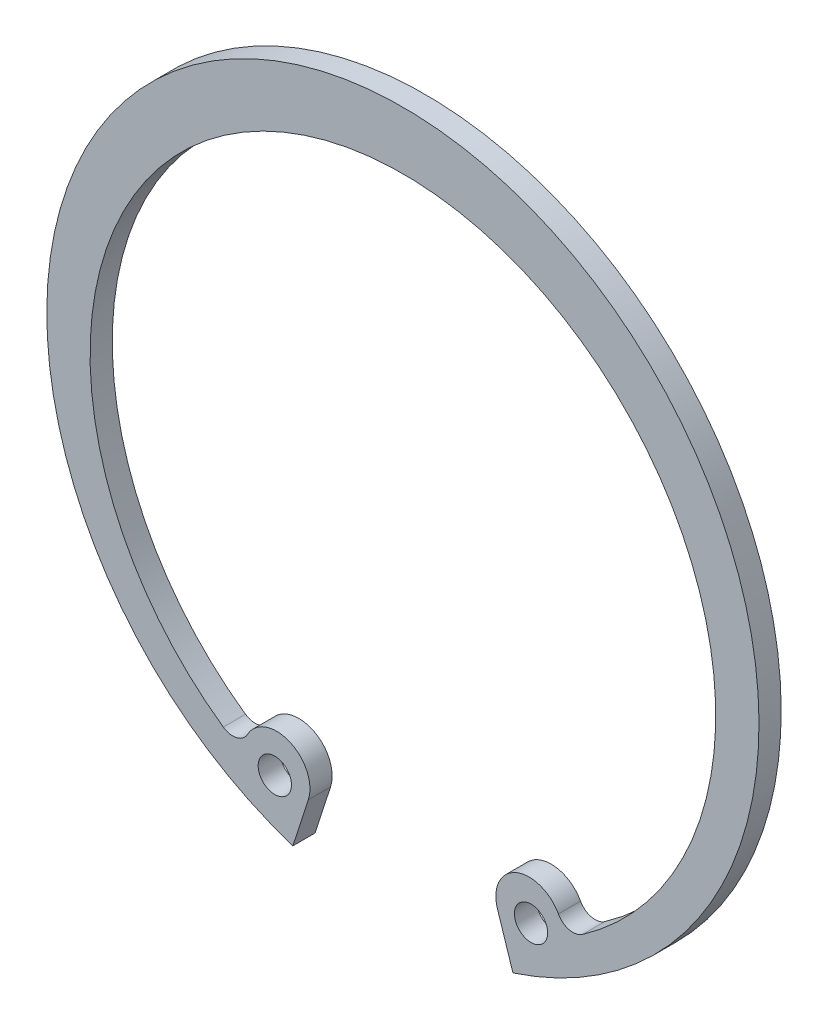
ISO-10303-21;
HEADER;
FILE_DESCRIPTION(('STEP AP214'),'2;1');
FILE_NAME('part.step','',(''),(''),'','','');
FILE_SCHEMA(('AUTOMOTIVE_DESIGN { 1 0 10303 214 1 1 1 1 }'));
ENDSEC;
DATA;
#1=APPLICATION_CONTEXT('core data for automotive mechanical design processes');
#2=APPLICATION_PROTOCOL_DEFINITION('international standard','automotive_design',2000,#1);
#3=PRODUCT_CONTEXT('',#1,'mechanical');
#4=PRODUCT('Part','Part','',(#3));
#5=PRODUCT_RELATED_PRODUCT_CATEGORY('part','',(#4));
#6=PRODUCT_DEFINITION_FORMATION('','',#4);
#7=PRODUCT_DEFINITION_CONTEXT('part definition',#1,'design');
#8=PRODUCT_DEFINITION('design','',#6,#7);
#9=PRODUCT_DEFINITION_SHAPE('','',#8);
#10=(LENGTH_UNIT() NAMED_UNIT(*) SI_UNIT(.MILLI.,.METRE.));
#11=(NAMED_UNIT(*) PLANE_ANGLE_UNIT() SI_UNIT($,.RADIAN.));
#12=(NAMED_UNIT(*) SI_UNIT($,.STERADIAN.) SOLID_ANGLE_UNIT());
#13=UNCERTAINTY_MEASURE_WITH_UNIT(LENGTH_MEASURE(1.E-05),#10,'distance_accuracy_value','');
#14=(GEOMETRIC_REPRESENTATION_CONTEXT(3) GLOBAL_UNCERTAINTY_ASSIGNED_CONTEXT((#13)) GLOBAL_UNIT_ASSIGNED_CONTEXT((#10,
#11,#12)) REPRESENTATION_CONTEXT('',''));
#15=CARTESIAN_POINT('',(0.,0.,0.));
#16=DIRECTION('',(0.,0.,1.));
#17=DIRECTION('',(1.,0.,0.));
#18=AXIS2_PLACEMENT_3D('',#15,#16,#17);
#19=CARTESIAN_POINT('',(-11.378133000963,-25.310088688355,2.));
#20=DIRECTION('',(0.,0.,1.));
#21=DIRECTION('',(1.,0.,0.));
#22=AXIS2_PLACEMENT_3D('',#19,#20,#21);
#23=PLANE('',#22);
#24=CARTESIAN_POINT('',(-11.5490746864897,-25.8361930997174,2.));
#25=DIRECTION('',(0.,0.,1.));
#26=DIRECTION('',(1.,0.,0.));
#27=AXIS2_PLACEMENT_3D('',#24,#25,#26);
#28=CIRCLE('',#27,1.5);
#29=CARTESIAN_POINT('',(-10.0490746864897,-25.8361930997174,2.));
#30=VERTEX_POINT('',#29);
#31=EDGE_CURVE('E139',#30,#30,#28,.T.);
#32=ORIENTED_EDGE('',*,*,#31,.F.);
#33=EDGE_LOOP('',(#32));
#34=FACE_BOUND('',#33,.T.);
#35=CARTESIAN_POINT('',(-11.378133000963,-25.310088688355,2.));
#36=DIRECTION('',(0.,0.,1.));
#37=DIRECTION('',(1.,0.,0.));
#38=AXIS2_PLACEMENT_3D('',#35,#36,#37);
#39=CIRCLE('',#38,3.);
#40=CARTESIAN_POINT('',(-8.52496345207758,-26.2371396714798,2.));
#41=VERTEX_POINT('',#40);
#42=CARTESIAN_POINT('',(-14.0134423692481,-23.8765111587358,2.));
#43=VERTEX_POINT('',#42);
#44=EDGE_CURVE('E152',#41,#43,#39,.T.);
#45=ORIENTED_EDGE('',*,*,#44,.T.);
#46=CARTESIAN_POINT('',(-15.3310970533906,-23.1597223939262,2.));
#47=DIRECTION('',(0.,0.,-1.));
#48=DIRECTION('',(-1.,0.,0.));
#49=AXIS2_PLACEMENT_3D('',#46,#47,#48);
#50=CIRCLE('',#49,1.5);
#51=CARTESIAN_POINT('',(-16.1923946406597,-24.3877966857198,2.));
#52=VERTEX_POINT('',#51);
#53=EDGE_CURVE('E98',#43,#52,#50,.T.);
#54=ORIENTED_EDGE('',*,*,#53,.T.);
#55=CARTESIAN_POINT('',(0.,-1.3,2.));
#56=DIRECTION('',(0.,0.,-1.));
#57=DIRECTION('',(1.,0.,0.));
#58=AXIS2_PLACEMENT_3D('',#55,#56,#57);
#59=CIRCLE('',#58,28.2);
#60=CARTESIAN_POINT('',(16.1923946406598,-24.3877966857198,2.));
#61=VERTEX_POINT('',#60);
#62=EDGE_CURVE('E167',#52,#61,#59,.T.);
#63=ORIENTED_EDGE('',*,*,#62,.T.);
#64=CARTESIAN_POINT('',(15.3310970533906,-23.1597223939262,2.));
#65=DIRECTION('',(0.,0.,-1.));
#66=DIRECTION('',(1.,0.,0.));
#67=AXIS2_PLACEMENT_3D('',#64,#65,#66);
#68=CIRCLE('',#67,1.5);
#69=CARTESIAN_POINT('',(14.0134423692481,-23.8765111587358,2.));
#70=VERTEX_POINT('',#69);
#71=EDGE_CURVE('E180',#61,#70,#68,.T.);
#72=ORIENTED_EDGE('',*,*,#71,.T.);
#73=CARTESIAN_POINT('',(11.3781330009631,-25.310088688355,2.));
#74=DIRECTION('',(0.,0.,1.));
#75=DIRECTION('',(-1.,0.,0.));
#76=AXIS2_PLACEMENT_3D('',#73,#74,#75);
#77=CIRCLE('',#76,3.);
#78=CARTESIAN_POINT('',(8.5249634520776,-26.2371396714798,2.));
#79=VERTEX_POINT('',#78);
#80=EDGE_CURVE('E117',#70,#79,#77,.T.);
#81=ORIENTED_EDGE('',*,*,#80,.T.);
#82=DIRECTION('',(0.309016994374948,-0.951056516295153,0.));
#83=VECTOR('',#82,1.);
#84=CARTESIAN_POINT('',(8.5249634520776,-26.2371396714798,2.));
#85=LINE('',#84,#83);
#86=CARTESIAN_POINT('',(9.91944551943583,-30.5289141730744,2.));
#87=VERTEX_POINT('',#86);
#88=EDGE_CURVE('E111',#79,#87,#85,.T.);
#89=ORIENTED_EDGE('',*,*,#88,.T.);
#90=CARTESIAN_POINT('',(0.,0.,2.));
#91=DIRECTION('',(0.,0.,1.));
#92=DIRECTION('',(1.,0.,0.));
#93=AXIS2_PLACEMENT_3D('',#90,#91,#92);
#94=CIRCLE('',#93,32.1);
#95=CARTESIAN_POINT('',(-9.91944551943583,-30.5289141730744,2.));
#96=VERTEX_POINT('',#95);
#97=EDGE_CURVE('E115',#87,#96,#94,.T.);
#98=ORIENTED_EDGE('',*,*,#97,.T.);
#99=DIRECTION('',(0.309016994374948,0.951056516295153,0.));
#100=VECTOR('',#99,1.);
#101=CARTESIAN_POINT('',(-8.52496345207758,-26.2371396714798,2.));
#102=LINE('',#101,#100);
#103=EDGE_CURVE('E55',#96,#41,#102,.T.);
#104=ORIENTED_EDGE('',*,*,#103,.T.);
#105=EDGE_LOOP('',(#45,#54,#63,#72,#81,#89,#98,#104));
#106=FACE_BOUND('',#105,.T.);
#107=CARTESIAN_POINT('',(11.5490746864897,-25.8361930997174,2.));
#108=DIRECTION('',(0.,0.,1.));
#109=DIRECTION('',(-1.,0.,0.));
#110=AXIS2_PLACEMENT_3D('',#107,#108,#109);
#111=CIRCLE('',#110,1.5);
#112=CARTESIAN_POINT('',(10.0490746864897,-25.8361930997174,2.));
#113=VERTEX_POINT('',#112);
#114=EDGE_CURVE('E190',#113,#113,#111,.T.);
#115=ORIENTED_EDGE('',*,*,#114,.F.);
#116=EDGE_LOOP('',(#115));
#117=FACE_BOUND('',#116,.T.);
#118=ADVANCED_FACE('F38',(#34,#106,#117),#23,.T.);
#119=CARTESIAN_POINT('',(-11.378133000963,-25.310088688355,0.));
#120=DIRECTION('',(0.,0.,1.));
#121=DIRECTION('',(1.,0.,0.));
#122=AXIS2_PLACEMENT_3D('',#119,#120,#121);
#123=PLANE('',#122);
#124=CARTESIAN_POINT('',(-11.378133000963,-25.310088688355,0.));
#125=DIRECTION('',(0.,0.,1.));
#126=DIRECTION('',(1.,0.,0.));
#127=AXIS2_PLACEMENT_3D('',#124,#125,#126);
#128=CIRCLE('',#127,3.);
#129=CARTESIAN_POINT('',(-8.52496345207758,-26.2371396714798,0.));
#130=VERTEX_POINT('',#129);
#131=CARTESIAN_POINT('',(-14.0134423692481,-23.8765111587358,0.));
#132=VERTEX_POINT('',#131);
#133=EDGE_CURVE('E135',#130,#132,#128,.T.);
#134=ORIENTED_EDGE('',*,*,#133,.F.);
#135=DIRECTION('',(0.309016994374948,0.951056516295153,0.));
#136=VECTOR('',#135,1.);
#137=CARTESIAN_POINT('',(-8.52496345207758,-26.2371396714798,0.));
#138=LINE('',#137,#136);
#139=CARTESIAN_POINT('',(-9.91944551943583,-30.5289141730744,0.));
#140=VERTEX_POINT('',#139);
#141=EDGE_CURVE('E90',#140,#130,#138,.T.);
#142=ORIENTED_EDGE('',*,*,#141,.F.);
#143=CARTESIAN_POINT('',(0.,0.,0.));
#144=DIRECTION('',(0.,0.,1.));
#145=DIRECTION('',(1.,0.,0.));
#146=AXIS2_PLACEMENT_3D('',#143,#144,#145);
#147=CIRCLE('',#146,32.1);
#148=CARTESIAN_POINT('',(9.91944551943583,-30.5289141730744,0.));
#149=VERTEX_POINT('',#148);
#150=EDGE_CURVE('E84',#149,#140,#147,.T.);
#151=ORIENTED_EDGE('',*,*,#150,.F.);
#152=DIRECTION('',(0.309016994374948,-0.951056516295153,0.));
#153=VECTOR('',#152,1.);
#154=CARTESIAN_POINT('',(8.5249634520776,-26.2371396714798,0.));
#155=LINE('',#154,#153);
#156=CARTESIAN_POINT('',(8.5249634520776,-26.2371396714798,0.));
#157=VERTEX_POINT('',#156);
#158=EDGE_CURVE('E125',#157,#149,#155,.T.);
#159=ORIENTED_EDGE('',*,*,#158,.F.);
#160=CARTESIAN_POINT('',(11.3781330009631,-25.310088688355,0.));
#161=DIRECTION('',(0.,0.,1.));
#162=DIRECTION('',(-1.,0.,0.));
#163=AXIS2_PLACEMENT_3D('',#160,#161,#162);
#164=CIRCLE('',#163,3.);
#165=CARTESIAN_POINT('',(14.0134423692481,-23.8765111587358,0.));
#166=VERTEX_POINT('',#165);
#167=EDGE_CURVE('E146',#166,#157,#164,.T.);
#168=ORIENTED_EDGE('',*,*,#167,.F.);
#169=CARTESIAN_POINT('',(15.3310970533906,-23.1597223939262,0.));
#170=DIRECTION('',(0.,0.,-1.));
#171=DIRECTION('',(1.,0.,0.));
#172=AXIS2_PLACEMENT_3D('',#169,#170,#171);
#173=CIRCLE('',#172,1.5);
#174=CARTESIAN_POINT('',(16.1923946406598,-24.3877966857198,0.));
#175=VERTEX_POINT('',#174);
#176=EDGE_CURVE('E144',#175,#166,#173,.T.);
#177=ORIENTED_EDGE('',*,*,#176,.F.);
#178=CARTESIAN_POINT('',(0.,-1.3,0.));
#179=DIRECTION('',(0.,0.,-1.));
#180=DIRECTION('',(1.,0.,0.));
#181=AXIS2_PLACEMENT_3D('',#178,#179,#180);
#182=CIRCLE('',#181,28.2);
#183=CARTESIAN_POINT('',(-16.1923946406597,-24.3877966857198,0.));
#184=VERTEX_POINT('',#183);
#185=EDGE_CURVE('E141',#184,#175,#182,.T.);
#186=ORIENTED_EDGE('',*,*,#185,.F.);
#187=CARTESIAN_POINT('',(-15.3310970533906,-23.1597223939262,0.));
#188=DIRECTION('',(0.,0.,-1.));
#189=DIRECTION('',(-1.,0.,0.));
#190=AXIS2_PLACEMENT_3D('',#187,#188,#189);
#191=CIRCLE('',#190,1.5);
#192=EDGE_CURVE('E138',#132,#184,#191,.T.);
#193=ORIENTED_EDGE('',*,*,#192,.F.);
#194=EDGE_LOOP('',(#134,#142,#151,#159,#168,#177,#186,#193));
#195=FACE_BOUND('',#194,.T.);
#196=CARTESIAN_POINT('',(-11.5490746864897,-25.8361930997174,0.));
#197=DIRECTION('',(0.,0.,1.));
#198=DIRECTION('',(1.,0.,0.));
#199=AXIS2_PLACEMENT_3D('',#196,#197,#198);
#200=CIRCLE('',#199,1.5);
#201=CARTESIAN_POINT('',(-10.0490746864897,-25.8361930997174,0.));
#202=VERTEX_POINT('',#201);
#203=EDGE_CURVE('E187',#202,#202,#200,.T.);
#204=ORIENTED_EDGE('',*,*,#203,.T.);
#205=EDGE_LOOP('',(#204));
#206=FACE_BOUND('',#205,.T.);
#207=CARTESIAN_POINT('',(11.5490746864897,-25.8361930997174,0.));
#208=DIRECTION('',(0.,0.,1.));
#209=DIRECTION('',(-1.,0.,0.));
#210=AXIS2_PLACEMENT_3D('',#207,#208,#209);
#211=CIRCLE('',#210,1.5);
#212=CARTESIAN_POINT('',(10.0490746864897,-25.8361930997174,0.));
#213=VERTEX_POINT('',#212);
#214=EDGE_CURVE('E193',#213,#213,#211,.T.);
#215=ORIENTED_EDGE('',*,*,#214,.T.);
#216=EDGE_LOOP('',(#215));
#217=FACE_BOUND('',#216,.T.);
#218=ADVANCED_FACE('F171',(#195,#206,#217),#123,.F.);
#219=CARTESIAN_POINT('',(-11.378133000963,-25.310088688355,2.));
#220=DIRECTION('',(0.,0.,-1.));
#221=DIRECTION('',(-1.,0.,0.));
#222=AXIS2_PLACEMENT_3D('',#219,#220,#221);
#223=CYLINDRICAL_SURFACE('',#222,3.);
#224=ORIENTED_EDGE('',*,*,#133,.T.);
#225=DIRECTION('',(0.,0.,-1.));
#226=VECTOR('',#225,1.);
#227=CARTESIAN_POINT('',(-14.0134423692481,-23.8765111587358,2.));
#228=LINE('',#227,#226);
#229=EDGE_CURVE('E11',#43,#132,#228,.T.);
#230=ORIENTED_EDGE('',*,*,#229,.F.);
#231=ORIENTED_EDGE('',*,*,#44,.F.);
#232=DIRECTION('',(0.,0.,-1.));
#233=VECTOR('',#232,1.);
#234=CARTESIAN_POINT('',(-8.52496345207758,-26.2371396714798,2.));
#235=LINE('',#234,#233);
#236=EDGE_CURVE('E131',#41,#130,#235,.T.);
#237=ORIENTED_EDGE('',*,*,#236,.T.);
#238=EDGE_LOOP('',(#224,#230,#231,#237));
#239=FACE_BOUND('',#238,.T.);
#240=ADVANCED_FACE('F40',(#239),#223,.T.);
#241=CARTESIAN_POINT('',(-15.3310970533906,-23.1597223939262,2.));
#242=DIRECTION('',(0.,0.,-1.));
#243=DIRECTION('',(-1.,0.,0.));
#244=AXIS2_PLACEMENT_3D('',#241,#242,#243);
#245=CYLINDRICAL_SURFACE('',#244,1.5);
#246=ORIENTED_EDGE('',*,*,#192,.T.);
#247=DIRECTION('',(0.,0.,-1.));
#248=VECTOR('',#247,1.);
#249=CARTESIAN_POINT('',(-16.1923946406597,-24.3877966857198,2.));
#250=LINE('',#249,#248);
#251=EDGE_CURVE('E47',#52,#184,#250,.T.);
#252=ORIENTED_EDGE('',*,*,#251,.F.);
#253=ORIENTED_EDGE('',*,*,#53,.F.);
#254=ORIENTED_EDGE('',*,*,#229,.T.);
#255=EDGE_LOOP('',(#246,#252,#253,#254));
#256=FACE_BOUND('',#255,.T.);
#257=ADVANCED_FACE('F225',(#256),#245,.F.);
#258=CARTESIAN_POINT('',(0.,-1.3,2.));
#259=DIRECTION('',(0.,0.,-1.));
#260=DIRECTION('',(-1.,0.,0.));
#261=AXIS2_PLACEMENT_3D('',#258,#259,#260);
#262=CYLINDRICAL_SURFACE('',#261,28.2);
#263=ORIENTED_EDGE('',*,*,#185,.T.);
#264=DIRECTION('',(0.,0.,-1.));
#265=VECTOR('',#264,1.);
#266=CARTESIAN_POINT('',(16.1923946406598,-24.3877966857198,2.));
#267=LINE('',#266,#265);
#268=EDGE_CURVE('E159',#61,#175,#267,.T.);
#269=ORIENTED_EDGE('',*,*,#268,.F.);
#270=ORIENTED_EDGE('',*,*,#62,.F.);
#271=ORIENTED_EDGE('',*,*,#251,.T.);
#272=EDGE_LOOP('',(#263,#269,#270,#271));
#273=FACE_BOUND('',#272,.T.);
#274=ADVANCED_FACE('F165',(#273),#262,.F.);
#275=CARTESIAN_POINT('',(15.3310970533906,-23.1597223939262,2.));
#276=DIRECTION('',(0.,0.,-1.));
#277=DIRECTION('',(-1.,0.,0.));
#278=AXIS2_PLACEMENT_3D('',#275,#276,#277);
#279=CYLINDRICAL_SURFACE('',#278,1.5);
#280=ORIENTED_EDGE('',*,*,#176,.T.);
#281=DIRECTION('',(0.,0.,-1.));
#282=VECTOR('',#281,1.);
#283=CARTESIAN_POINT('',(14.0134423692481,-23.8765111587358,2.));
#284=LINE('',#283,#282);
#285=EDGE_CURVE('E156',#70,#166,#284,.T.);
#286=ORIENTED_EDGE('',*,*,#285,.F.);
#287=ORIENTED_EDGE('',*,*,#71,.F.);
#288=ORIENTED_EDGE('',*,*,#268,.T.);
#289=EDGE_LOOP('',(#280,#286,#287,#288));
#290=FACE_BOUND('',#289,.T.);
#291=ADVANCED_FACE('F176',(#290),#279,.F.);
#292=CARTESIAN_POINT('',(11.3781330009631,-25.310088688355,2.));
#293=DIRECTION('',(0.,0.,-1.));
#294=DIRECTION('',(-1.,0.,0.));
#295=AXIS2_PLACEMENT_3D('',#292,#293,#294);
#296=CYLINDRICAL_SURFACE('',#295,3.);
#297=ORIENTED_EDGE('',*,*,#167,.T.);
#298=DIRECTION('',(0.,0.,-1.));
#299=VECTOR('',#298,1.);
#300=CARTESIAN_POINT('',(8.5249634520776,-26.2371396714798,2.));
#301=LINE('',#300,#299);
#302=EDGE_CURVE('E126',#79,#157,#301,.T.);
#303=ORIENTED_EDGE('',*,*,#302,.F.);
#304=ORIENTED_EDGE('',*,*,#80,.F.);
#305=ORIENTED_EDGE('',*,*,#285,.T.);
#306=EDGE_LOOP('',(#297,#303,#304,#305));
#307=FACE_BOUND('',#306,.T.);
#308=ADVANCED_FACE('F179',(#307),#296,.T.);
#309=CARTESIAN_POINT('',(8.5249634520776,-26.2371396714798,2.));
#310=DIRECTION('',(0.951056516295154,0.309016994374948,0.));
#311=DIRECTION('',(-0.309016994374948,0.951056516295154,0.));
#312=AXIS2_PLACEMENT_3D('',#309,#310,#311);
#313=PLANE('',#312);
#314=ORIENTED_EDGE('',*,*,#158,.T.);
#315=DIRECTION('',(0.,0.,-1.));
#316=VECTOR('',#315,1.);
#317=CARTESIAN_POINT('',(9.91944551943583,-30.5289141730744,2.));
#318=LINE('',#317,#316);
#319=EDGE_CURVE('E122',#87,#149,#318,.T.);
#320=ORIENTED_EDGE('',*,*,#319,.F.);
#321=ORIENTED_EDGE('',*,*,#88,.F.);
#322=ORIENTED_EDGE('',*,*,#302,.T.);
#323=EDGE_LOOP('',(#314,#320,#321,#322));
#324=FACE_BOUND('',#323,.T.);
#325=ADVANCED_FACE('F123',(#324),#313,.F.);
#326=CARTESIAN_POINT('',(0.,0.,2.));
#327=DIRECTION('',(0.,0.,-1.));
#328=DIRECTION('',(-1.,0.,0.));
#329=AXIS2_PLACEMENT_3D('',#326,#327,#328);
#330=CYLINDRICAL_SURFACE('',#329,32.1);
#331=ORIENTED_EDGE('',*,*,#150,.T.);
#332=DIRECTION('',(0.,0.,-1.));
#333=VECTOR('',#332,1.);
#334=CARTESIAN_POINT('',(-9.91944551943583,-30.5289141730744,2.));
#335=LINE('',#334,#333);
#336=EDGE_CURVE('E127',#96,#140,#335,.T.);
#337=ORIENTED_EDGE('',*,*,#336,.F.);
#338=ORIENTED_EDGE('',*,*,#97,.F.);
#339=ORIENTED_EDGE('',*,*,#319,.T.);
#340=EDGE_LOOP('',(#331,#337,#338,#339));
#341=FACE_BOUND('',#340,.T.);
#342=ADVANCED_FACE('F129',(#341),#330,.T.);
#343=CARTESIAN_POINT('',(-8.52496345207758,-26.2371396714798,2.));
#344=DIRECTION('',(-0.951056516295154,0.309016994374948,0.));
#345=DIRECTION('',(-0.309016994374948,-0.951056516295154,0.));
#346=AXIS2_PLACEMENT_3D('',#343,#344,#345);
#347=PLANE('',#346);
#348=ORIENTED_EDGE('',*,*,#141,.T.);
#349=ORIENTED_EDGE('',*,*,#236,.F.);
#350=ORIENTED_EDGE('',*,*,#103,.F.);
#351=ORIENTED_EDGE('',*,*,#336,.T.);
#352=EDGE_LOOP('',(#348,#349,#350,#351));
#353=FACE_BOUND('',#352,.T.);
#354=ADVANCED_FACE('F213',(#353),#347,.F.);
#355=CARTESIAN_POINT('',(-11.5490746864897,-25.8361930997174,2.));
#356=DIRECTION('',(0.,0.,-1.));
#357=DIRECTION('',(-1.,0.,0.));
#358=AXIS2_PLACEMENT_3D('',#355,#356,#357);
#359=CYLINDRICAL_SURFACE('',#358,1.5);
#360=ORIENTED_EDGE('',*,*,#31,.T.);
#361=EDGE_LOOP('',(#360));
#362=FACE_BOUND('',#361,.T.);
#363=ORIENTED_EDGE('',*,*,#203,.F.);
#364=EDGE_LOOP('',(#363));
#365=FACE_BOUND('',#364,.T.);
#366=ADVANCED_FACE('F210',(#362,#365),#359,.F.);
#367=CARTESIAN_POINT('',(11.5490746864897,-25.8361930997174,2.));
#368=DIRECTION('',(0.,0.,-1.));
#369=DIRECTION('',(-1.,0.,0.));
#370=AXIS2_PLACEMENT_3D('',#367,#368,#369);
#371=CYLINDRICAL_SURFACE('',#370,1.5);
#372=ORIENTED_EDGE('',*,*,#114,.T.);
#373=EDGE_LOOP('',(#372));
#374=FACE_BOUND('',#373,.T.);
#375=ORIENTED_EDGE('',*,*,#214,.F.);
#376=EDGE_LOOP('',(#375));
#377=FACE_BOUND('',#376,.T.);
#378=ADVANCED_FACE('F199',(#374,#377),#371,.F.);
#379=CLOSED_SHELL('',(#118,#218,#240,#257,#274,#291,#308,#325,#342,#354,#366,#378));
#380=MANIFOLD_SOLID_BREP('B2',#379);
#381=ADVANCED_BREP_SHAPE_REPRESENTATION('',(#18,#380),#14);
#382=SHAPE_DEFINITION_REPRESENTATION(#9,#381);
ENDSEC;
END-ISO-10303-21;
